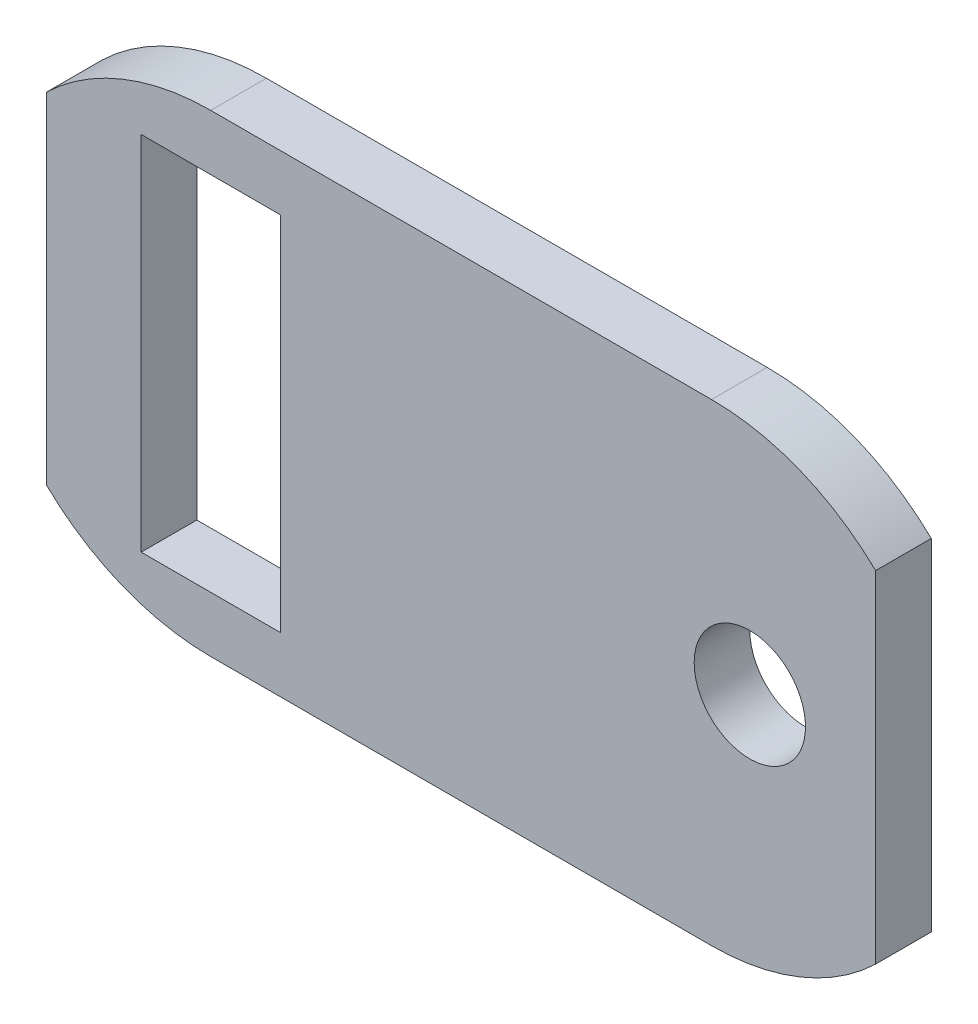
ISO-10303-21;
HEADER;
FILE_DESCRIPTION(('STEP AP214'),'2;1');
FILE_NAME('part.step','',(''),(''),'','','');
FILE_SCHEMA(('AUTOMOTIVE_DESIGN { 1 0 10303 214 1 1 1 1 }'));
ENDSEC;
DATA;
#1=APPLICATION_CONTEXT('core data for automotive mechanical design processes');
#2=APPLICATION_PROTOCOL_DEFINITION('international standard','automotive_design',2000,#1);
#3=PRODUCT_CONTEXT('',#1,'mechanical');
#4=PRODUCT('Part','Part','',(#3));
#5=PRODUCT_RELATED_PRODUCT_CATEGORY('part','',(#4));
#6=PRODUCT_DEFINITION_FORMATION('','',#4);
#7=PRODUCT_DEFINITION_CONTEXT('part definition',#1,'design');
#8=PRODUCT_DEFINITION('design','',#6,#7);
#9=PRODUCT_DEFINITION_SHAPE('','',#8);
#10=(LENGTH_UNIT() NAMED_UNIT(*) SI_UNIT(.MILLI.,.METRE.));
#11=(NAMED_UNIT(*) PLANE_ANGLE_UNIT() SI_UNIT($,.RADIAN.));
#12=(NAMED_UNIT(*) SI_UNIT($,.STERADIAN.) SOLID_ANGLE_UNIT());
#13=UNCERTAINTY_MEASURE_WITH_UNIT(LENGTH_MEASURE(1.E-05),#10,'distance_accuracy_value','');
#14=(GEOMETRIC_REPRESENTATION_CONTEXT(3) GLOBAL_UNCERTAINTY_ASSIGNED_CONTEXT((#13)) GLOBAL_UNIT_ASSIGNED_CONTEXT((#10,
#11,#12)) REPRESENTATION_CONTEXT('',''));
#15=CARTESIAN_POINT('',(0.,0.,0.));
#16=DIRECTION('',(0.,0.,1.));
#17=DIRECTION('',(1.,0.,0.));
#18=AXIS2_PLACEMENT_3D('',#15,#16,#17);
#19=CARTESIAN_POINT('',(38.6757267871688,-27.4690515955081,10.));
#20=DIRECTION('',(0.,0.,-1.));
#21=DIRECTION('',(-1.,0.,0.));
#22=AXIS2_PLACEMENT_3D('',#19,#20,#21);
#23=CYLINDRICAL_SURFACE('',#22,42.5);
#24=CARTESIAN_POINT('',(38.6757267871688,-27.4690515955081,0.));
#25=DIRECTION('',(0.,0.,1.));
#26=DIRECTION('',(-1.,0.,0.));
#27=AXIS2_PLACEMENT_3D('',#24,#25,#26);
#28=CIRCLE('',#27,42.5);
#29=CARTESIAN_POINT('',(38.6757267871688,-69.9690515955081,0.));
#30=VERTEX_POINT('',#29);
#31=CARTESIAN_POINT('',(68.1495571176142,-58.0883808770603,0.));
#32=VERTEX_POINT('',#31);
#33=EDGE_CURVE('E158',#30,#32,#28,.T.);
#34=ORIENTED_EDGE('',*,*,#33,.T.);
#35=DIRECTION('',(0.,0.,-1.));
#36=VECTOR('',#35,1.);
#37=CARTESIAN_POINT('',(68.1495571176142,-58.0883808770603,10.));
#38=LINE('',#37,#36);
#39=CARTESIAN_POINT('',(68.1495571176142,-58.0883808770603,10.));
#40=VERTEX_POINT('',#39);
#41=EDGE_CURVE('E11',#40,#32,#38,.T.);
#42=ORIENTED_EDGE('',*,*,#41,.F.);
#43=CARTESIAN_POINT('',(38.6757267871688,-27.4690515955081,10.));
#44=DIRECTION('',(0.,0.,1.));
#45=DIRECTION('',(-1.,0.,0.));
#46=AXIS2_PLACEMENT_3D('',#43,#44,#45);
#47=CIRCLE('',#46,42.5);
#48=CARTESIAN_POINT('',(38.6757267871688,-69.9690515955081,10.));
#49=VERTEX_POINT('',#48);
#50=EDGE_CURVE('E159',#49,#40,#47,.T.);
#51=ORIENTED_EDGE('',*,*,#50,.F.);
#52=DIRECTION('',(0.,0.,-1.));
#53=VECTOR('',#52,1.);
#54=CARTESIAN_POINT('',(38.6757267871688,-69.9690515955081,10.));
#55=LINE('',#54,#53);
#56=EDGE_CURVE('E177',#49,#30,#55,.T.);
#57=ORIENTED_EDGE('',*,*,#56,.T.);
#58=EDGE_LOOP('',(#34,#42,#51,#57));
#59=FACE_BOUND('',#58,.T.);
#60=ADVANCED_FACE('F33',(#59),#23,.T.);
#61=CARTESIAN_POINT('',(68.1495571176142,3.15027768604416,10.));
#62=DIRECTION('',(-1.,0.,0.));
#63=DIRECTION('',(0.,0.,1.));
#64=AXIS2_PLACEMENT_3D('',#61,#62,#63);
#65=PLANE('',#64);
#66=DIRECTION('',(0.,1.,0.));
#67=VECTOR('',#66,1.);
#68=CARTESIAN_POINT('',(68.1495571176142,3.15027768604416,0.));
#69=LINE('',#68,#67);
#70=CARTESIAN_POINT('',(68.1495571176142,3.15027768604416,0.));
#71=VERTEX_POINT('',#70);
#72=EDGE_CURVE('E180',#32,#71,#69,.T.);
#73=ORIENTED_EDGE('',*,*,#72,.T.);
#74=DIRECTION('',(0.,0.,-1.));
#75=VECTOR('',#74,1.);
#76=CARTESIAN_POINT('',(68.1495571176142,3.15027768604416,10.));
#77=LINE('',#76,#75);
#78=CARTESIAN_POINT('',(68.1495571176142,3.15027768604416,10.));
#79=VERTEX_POINT('',#78);
#80=EDGE_CURVE('E40',#79,#71,#77,.T.);
#81=ORIENTED_EDGE('',*,*,#80,.F.);
#82=DIRECTION('',(0.,1.,0.));
#83=VECTOR('',#82,1.);
#84=CARTESIAN_POINT('',(68.1495571176142,3.15027768604416,10.));
#85=LINE('',#84,#83);
#86=EDGE_CURVE('E162',#40,#79,#85,.T.);
#87=ORIENTED_EDGE('',*,*,#86,.F.);
#88=ORIENTED_EDGE('',*,*,#41,.T.);
#89=EDGE_LOOP('',(#73,#81,#87,#88));
#90=FACE_BOUND('',#89,.T.);
#91=ADVANCED_FACE('F235',(#90),#65,.F.);
#92=CARTESIAN_POINT('',(38.6757267871688,-27.4690515955081,10.));
#93=DIRECTION('',(0.,0.,-1.));
#94=DIRECTION('',(-1.,0.,0.));
#95=AXIS2_PLACEMENT_3D('',#92,#93,#94);
#96=CYLINDRICAL_SURFACE('',#95,42.5);
#97=CARTESIAN_POINT('',(38.6757267871688,-27.4690515955081,0.));
#98=DIRECTION('',(0.,0.,1.));
#99=DIRECTION('',(-1.,0.,0.));
#100=AXIS2_PLACEMENT_3D('',#97,#98,#99);
#101=CIRCLE('',#100,42.5);
#102=CARTESIAN_POINT('',(38.6757267871688,15.0309484044919,0.));
#103=VERTEX_POINT('',#102);
#104=EDGE_CURVE('E182',#71,#103,#101,.T.);
#105=ORIENTED_EDGE('',*,*,#104,.T.);
#106=DIRECTION('',(0.,0.,-1.));
#107=VECTOR('',#106,1.);
#108=CARTESIAN_POINT('',(38.6757267871688,15.0309484044919,10.));
#109=LINE('',#108,#107);
#110=CARTESIAN_POINT('',(38.6757267871688,15.0309484044919,10.));
#111=VERTEX_POINT('',#110);
#112=EDGE_CURVE('E207',#111,#103,#109,.T.);
#113=ORIENTED_EDGE('',*,*,#112,.F.);
#114=CARTESIAN_POINT('',(38.6757267871688,-27.4690515955081,10.));
#115=DIRECTION('',(0.,0.,1.));
#116=DIRECTION('',(-1.,0.,0.));
#117=AXIS2_PLACEMENT_3D('',#114,#115,#116);
#118=CIRCLE('',#117,42.5);
#119=EDGE_CURVE('E165',#79,#111,#118,.T.);
#120=ORIENTED_EDGE('',*,*,#119,.F.);
#121=ORIENTED_EDGE('',*,*,#80,.T.);
#122=EDGE_LOOP('',(#105,#113,#120,#121));
#123=FACE_BOUND('',#122,.T.);
#124=ADVANCED_FACE('F214',(#123),#96,.T.);
#125=CARTESIAN_POINT('',(-51.3242732128312,15.030948404492,10.));
#126=DIRECTION('',(0.,-1.,0.));
#127=DIRECTION('',(1.,0.,0.));
#128=AXIS2_PLACEMENT_3D('',#125,#126,#127);
#129=PLANE('',#128);
#130=DIRECTION('',(-1.,0.,0.));
#131=VECTOR('',#130,1.);
#132=CARTESIAN_POINT('',(-51.3242732128312,15.030948404492,0.));
#133=LINE('',#132,#131);
#134=CARTESIAN_POINT('',(-51.3242732128312,15.0309484044919,0.));
#135=VERTEX_POINT('',#134);
#136=EDGE_CURVE('E184',#103,#135,#133,.T.);
#137=ORIENTED_EDGE('',*,*,#136,.T.);
#138=DIRECTION('',(0.,0.,-1.));
#139=VECTOR('',#138,1.);
#140=CARTESIAN_POINT('',(-51.3242732128312,15.0309484044919,10.));
#141=LINE('',#140,#139);
#142=CARTESIAN_POINT('',(-51.3242732128312,15.0309484044919,10.));
#143=VERTEX_POINT('',#142);
#144=EDGE_CURVE('E204',#143,#135,#141,.T.);
#145=ORIENTED_EDGE('',*,*,#144,.F.);
#146=DIRECTION('',(-1.,0.,0.));
#147=VECTOR('',#146,1.);
#148=CARTESIAN_POINT('',(-51.3242732128312,15.030948404492,10.));
#149=LINE('',#148,#147);
#150=EDGE_CURVE('E167',#111,#143,#149,.T.);
#151=ORIENTED_EDGE('',*,*,#150,.F.);
#152=ORIENTED_EDGE('',*,*,#112,.T.);
#153=EDGE_LOOP('',(#137,#145,#151,#152));
#154=FACE_BOUND('',#153,.T.);
#155=ADVANCED_FACE('F223',(#154),#129,.F.);
#156=CARTESIAN_POINT('',(-51.3242732128312,-27.4690515955081,10.));
#157=DIRECTION('',(0.,0.,-1.));
#158=DIRECTION('',(-1.,0.,0.));
#159=AXIS2_PLACEMENT_3D('',#156,#157,#158);
#160=CYLINDRICAL_SURFACE('',#159,42.5);
#161=CARTESIAN_POINT('',(-51.3242732128312,-27.4690515955081,0.));
#162=DIRECTION('',(0.,0.,1.));
#163=DIRECTION('',(1.,0.,0.));
#164=AXIS2_PLACEMENT_3D('',#161,#162,#163);
#165=CIRCLE('',#164,42.5);
#166=CARTESIAN_POINT('',(-80.7981035432765,3.15027768604416,0.));
#167=VERTEX_POINT('',#166);
#168=EDGE_CURVE('E186',#135,#167,#165,.T.);
#169=ORIENTED_EDGE('',*,*,#168,.T.);
#170=DIRECTION('',(0.,0.,-1.));
#171=VECTOR('',#170,1.);
#172=CARTESIAN_POINT('',(-80.7981035432765,3.15027768604416,10.));
#173=LINE('',#172,#171);
#174=CARTESIAN_POINT('',(-80.7981035432765,3.15027768604416,10.));
#175=VERTEX_POINT('',#174);
#176=EDGE_CURVE('E201',#175,#167,#173,.T.);
#177=ORIENTED_EDGE('',*,*,#176,.F.);
#178=CARTESIAN_POINT('',(-51.3242732128312,-27.4690515955081,10.));
#179=DIRECTION('',(0.,0.,1.));
#180=DIRECTION('',(1.,0.,0.));
#181=AXIS2_PLACEMENT_3D('',#178,#179,#180);
#182=CIRCLE('',#181,42.5);
#183=EDGE_CURVE('E169',#143,#175,#182,.T.);
#184=ORIENTED_EDGE('',*,*,#183,.F.);
#185=ORIENTED_EDGE('',*,*,#144,.T.);
#186=EDGE_LOOP('',(#169,#177,#184,#185));
#187=FACE_BOUND('',#186,.T.);
#188=ADVANCED_FACE('F227',(#187),#160,.T.);
#189=CARTESIAN_POINT('',(-80.7981035432765,3.15027768604416,10.));
#190=DIRECTION('',(1.,0.,0.));
#191=DIRECTION('',(0.,0.,-1.));
#192=AXIS2_PLACEMENT_3D('',#189,#190,#191);
#193=PLANE('',#192);
#194=DIRECTION('',(0.,-1.,0.));
#195=VECTOR('',#194,1.);
#196=CARTESIAN_POINT('',(-80.7981035432765,3.15027768604416,0.));
#197=LINE('',#196,#195);
#198=CARTESIAN_POINT('',(-80.7981035432765,-58.0883808770603,0.));
#199=VERTEX_POINT('',#198);
#200=EDGE_CURVE('E188',#167,#199,#197,.T.);
#201=ORIENTED_EDGE('',*,*,#200,.T.);
#202=DIRECTION('',(0.,0.,-1.));
#203=VECTOR('',#202,1.);
#204=CARTESIAN_POINT('',(-80.7981035432765,-58.0883808770603,10.));
#205=LINE('',#204,#203);
#206=CARTESIAN_POINT('',(-80.7981035432765,-58.0883808770603,10.));
#207=VERTEX_POINT('',#206);
#208=EDGE_CURVE('E198',#207,#199,#205,.T.);
#209=ORIENTED_EDGE('',*,*,#208,.F.);
#210=DIRECTION('',(0.,-1.,0.));
#211=VECTOR('',#210,1.);
#212=CARTESIAN_POINT('',(-80.7981035432765,3.15027768604416,10.));
#213=LINE('',#212,#211);
#214=EDGE_CURVE('E171',#175,#207,#213,.T.);
#215=ORIENTED_EDGE('',*,*,#214,.F.);
#216=ORIENTED_EDGE('',*,*,#176,.T.);
#217=EDGE_LOOP('',(#201,#209,#215,#216));
#218=FACE_BOUND('',#217,.T.);
#219=ADVANCED_FACE('F248',(#218),#193,.F.);
#220=CARTESIAN_POINT('',(-51.3242732128312,-27.4690515955081,10.));
#221=DIRECTION('',(0.,0.,-1.));
#222=DIRECTION('',(-1.,0.,0.));
#223=AXIS2_PLACEMENT_3D('',#220,#221,#222);
#224=CYLINDRICAL_SURFACE('',#223,42.5);
#225=CARTESIAN_POINT('',(-51.3242732128312,-27.4690515955081,0.));
#226=DIRECTION('',(0.,0.,1.));
#227=DIRECTION('',(1.,0.,0.));
#228=AXIS2_PLACEMENT_3D('',#225,#226,#227);
#229=CIRCLE('',#228,42.5);
#230=CARTESIAN_POINT('',(-51.3242732128312,-69.9690515955081,0.));
#231=VERTEX_POINT('',#230);
#232=EDGE_CURVE('E190',#199,#231,#229,.T.);
#233=ORIENTED_EDGE('',*,*,#232,.T.);
#234=DIRECTION('',(0.,0.,-1.));
#235=VECTOR('',#234,1.);
#236=CARTESIAN_POINT('',(-51.3242732128312,-69.9690515955081,10.));
#237=LINE('',#236,#235);
#238=CARTESIAN_POINT('',(-51.3242732128312,-69.9690515955081,10.));
#239=VERTEX_POINT('',#238);
#240=EDGE_CURVE('E195',#239,#231,#237,.T.);
#241=ORIENTED_EDGE('',*,*,#240,.F.);
#242=CARTESIAN_POINT('',(-51.3242732128312,-27.4690515955081,10.));
#243=DIRECTION('',(0.,0.,1.));
#244=DIRECTION('',(1.,0.,0.));
#245=AXIS2_PLACEMENT_3D('',#242,#243,#244);
#246=CIRCLE('',#245,42.5);
#247=EDGE_CURVE('E173',#207,#239,#246,.T.);
#248=ORIENTED_EDGE('',*,*,#247,.F.);
#249=ORIENTED_EDGE('',*,*,#208,.T.);
#250=EDGE_LOOP('',(#233,#241,#248,#249));
#251=FACE_BOUND('',#250,.T.);
#252=ADVANCED_FACE('F246',(#251),#224,.T.);
#253=CARTESIAN_POINT('',(38.6757267871688,-69.9690515955081,10.));
#254=DIRECTION('',(0.,1.,0.));
#255=DIRECTION('',(0.,0.,1.));
#256=AXIS2_PLACEMENT_3D('',#253,#254,#255);
#257=PLANE('',#256);
#258=DIRECTION('',(1.,0.,0.));
#259=VECTOR('',#258,1.);
#260=CARTESIAN_POINT('',(38.6757267871688,-69.9690515955081,0.));
#261=LINE('',#260,#259);
#262=EDGE_CURVE('E163',#231,#30,#261,.T.);
#263=ORIENTED_EDGE('',*,*,#262,.T.);
#264=ORIENTED_EDGE('',*,*,#56,.F.);
#265=DIRECTION('',(1.,0.,0.));
#266=VECTOR('',#265,1.);
#267=CARTESIAN_POINT('',(38.6757267871688,-69.9690515955081,10.));
#268=LINE('',#267,#266);
#269=EDGE_CURVE('E175',#239,#49,#268,.T.);
#270=ORIENTED_EDGE('',*,*,#269,.F.);
#271=ORIENTED_EDGE('',*,*,#240,.T.);
#272=EDGE_LOOP('',(#263,#264,#270,#271));
#273=FACE_BOUND('',#272,.T.);
#274=ADVANCED_FACE('F241',(#273),#257,.F.);
#275=CARTESIAN_POINT('',(38.6757267871688,-27.4690515955081,10.));
#276=DIRECTION('',(0.,0.,-1.));
#277=DIRECTION('',(-1.,0.,0.));
#278=AXIS2_PLACEMENT_3D('',#275,#276,#277);
#279=PLANE('',#278);
#280=CARTESIAN_POINT('',(45.5439814509653,-27.469051595508,10.));
#281=DIRECTION('',(0.,0.,-1.));
#282=DIRECTION('',(-1.,0.,0.));
#283=AXIS2_PLACEMENT_3D('',#280,#281,#282);
#284=CIRCLE('',#283,9.99999999999999);
#285=CARTESIAN_POINT('',(35.5439814509653,-27.469051595508,10.));
#286=VERTEX_POINT('',#285);
#287=EDGE_CURVE('E366',#286,#286,#284,.T.);
#288=ORIENTED_EDGE('',*,*,#287,.T.);
#289=EDGE_LOOP('',(#288));
#290=FACE_BOUND('',#289,.T.);
#291=DIRECTION('',(-1.,0.,0.));
#292=VECTOR('',#291,1.);
#293=CARTESIAN_POINT('',(38.6757267871688,-59.9690515955081,10.));
#294=LINE('',#293,#292);
#295=CARTESIAN_POINT('',(-38.8242732128312,-59.9690515955081,10.));
#296=VERTEX_POINT('',#295);
#297=CARTESIAN_POINT('',(-63.8242732128312,-59.9690515955081,10.));
#298=VERTEX_POINT('',#297);
#299=EDGE_CURVE('E152',#296,#298,#294,.T.);
#300=ORIENTED_EDGE('',*,*,#299,.T.);
#301=DIRECTION('',(0.,1.,0.));
#302=VECTOR('',#301,1.);
#303=CARTESIAN_POINT('',(-63.8242732128312,-27.4690515955081,10.));
#304=LINE('',#303,#302);
#305=CARTESIAN_POINT('',(-63.8242732128312,5.03094840449193,10.));
#306=VERTEX_POINT('',#305);
#307=EDGE_CURVE('E155',#298,#306,#304,.T.);
#308=ORIENTED_EDGE('',*,*,#307,.T.);
#309=DIRECTION('',(1.,0.,0.));
#310=VECTOR('',#309,1.);
#311=CARTESIAN_POINT('',(38.6757267871688,5.03094840449193,10.));
#312=LINE('',#311,#310);
#313=CARTESIAN_POINT('',(-38.8242732128312,5.03094840449193,10.));
#314=VERTEX_POINT('',#313);
#315=EDGE_CURVE('E147',#306,#314,#312,.T.);
#316=ORIENTED_EDGE('',*,*,#315,.T.);
#317=DIRECTION('',(0.,-1.,0.));
#318=VECTOR('',#317,1.);
#319=CARTESIAN_POINT('',(-38.8242732128312,-27.4690515955081,10.));
#320=LINE('',#319,#318);
#321=EDGE_CURVE('E127',#314,#296,#320,.T.);
#322=ORIENTED_EDGE('',*,*,#321,.T.);
#323=EDGE_LOOP('',(#300,#308,#316,#322));
#324=FACE_BOUND('',#323,.T.);
#325=ORIENTED_EDGE('',*,*,#50,.T.);
#326=ORIENTED_EDGE('',*,*,#86,.T.);
#327=ORIENTED_EDGE('',*,*,#119,.T.);
#328=ORIENTED_EDGE('',*,*,#150,.T.);
#329=ORIENTED_EDGE('',*,*,#183,.T.);
#330=ORIENTED_EDGE('',*,*,#214,.T.);
#331=ORIENTED_EDGE('',*,*,#247,.T.);
#332=ORIENTED_EDGE('',*,*,#269,.T.);
#333=EDGE_LOOP('',(#325,#326,#327,#328,#329,#330,#331,#332));
#334=FACE_BOUND('',#333,.T.);
#335=ADVANCED_FACE('F231',(#290,#324,#334),#279,.F.);
#336=CARTESIAN_POINT('',(38.6757267871688,-27.4690515955081,0.));
#337=DIRECTION('',(0.,0.,-1.));
#338=DIRECTION('',(-1.,0.,0.));
#339=AXIS2_PLACEMENT_3D('',#336,#337,#338);
#340=PLANE('',#339);
#341=CARTESIAN_POINT('',(45.5439814509653,-27.469051595508,0.));
#342=DIRECTION('',(0.,0.,-1.));
#343=DIRECTION('',(-1.,0.,0.));
#344=AXIS2_PLACEMENT_3D('',#341,#342,#343);
#345=CIRCLE('',#344,9.99999999999999);
#346=CARTESIAN_POINT('',(35.5439814509653,-27.469051595508,0.));
#347=VERTEX_POINT('',#346);
#348=EDGE_CURVE('E363',#347,#347,#345,.T.);
#349=ORIENTED_EDGE('',*,*,#348,.F.);
#350=EDGE_LOOP('',(#349));
#351=FACE_BOUND('',#350,.T.);
#352=DIRECTION('',(0.,1.,0.));
#353=VECTOR('',#352,1.);
#354=CARTESIAN_POINT('',(-63.8242732128312,-59.9690515955081,0.));
#355=LINE('',#354,#353);
#356=CARTESIAN_POINT('',(-63.8242732128312,-59.9690515955081,0.));
#357=VERTEX_POINT('',#356);
#358=CARTESIAN_POINT('',(-63.8242732128312,5.03094840449193,0.));
#359=VERTEX_POINT('',#358);
#360=EDGE_CURVE('E55',#357,#359,#355,.T.);
#361=ORIENTED_EDGE('',*,*,#360,.F.);
#362=DIRECTION('',(-1.,0.,0.));
#363=VECTOR('',#362,1.);
#364=CARTESIAN_POINT('',(-38.8242732128312,-59.9690515955081,0.));
#365=LINE('',#364,#363);
#366=CARTESIAN_POINT('',(-38.8242732128312,-59.9690515955081,0.));
#367=VERTEX_POINT('',#366);
#368=EDGE_CURVE('E140',#367,#357,#365,.T.);
#369=ORIENTED_EDGE('',*,*,#368,.F.);
#370=DIRECTION('',(0.,-1.,0.));
#371=VECTOR('',#370,1.);
#372=CARTESIAN_POINT('',(-38.8242732128312,-59.9690515955081,0.));
#373=LINE('',#372,#371);
#374=CARTESIAN_POINT('',(-38.8242732128312,5.03094840449193,0.));
#375=VERTEX_POINT('',#374);
#376=EDGE_CURVE('E124',#375,#367,#373,.T.);
#377=ORIENTED_EDGE('',*,*,#376,.F.);
#378=DIRECTION('',(1.,0.,0.));
#379=VECTOR('',#378,1.);
#380=CARTESIAN_POINT('',(-38.8242732128312,5.03094840449193,0.));
#381=LINE('',#380,#379);
#382=EDGE_CURVE('E133',#359,#375,#381,.T.);
#383=ORIENTED_EDGE('',*,*,#382,.F.);
#384=EDGE_LOOP('',(#361,#369,#377,#383));
#385=FACE_BOUND('',#384,.T.);
#386=ORIENTED_EDGE('',*,*,#33,.F.);
#387=ORIENTED_EDGE('',*,*,#262,.F.);
#388=ORIENTED_EDGE('',*,*,#232,.F.);
#389=ORIENTED_EDGE('',*,*,#200,.F.);
#390=ORIENTED_EDGE('',*,*,#168,.F.);
#391=ORIENTED_EDGE('',*,*,#136,.F.);
#392=ORIENTED_EDGE('',*,*,#104,.F.);
#393=ORIENTED_EDGE('',*,*,#72,.F.);
#394=EDGE_LOOP('',(#386,#387,#388,#389,#390,#391,#392,#393));
#395=FACE_BOUND('',#394,.T.);
#396=ADVANCED_FACE('F137',(#351,#385,#395),#340,.T.);
#397=CARTESIAN_POINT('',(-63.8242732128312,-59.9690515955081,20.));
#398=DIRECTION('',(-1.,0.,0.));
#399=DIRECTION('',(0.,0.,1.));
#400=AXIS2_PLACEMENT_3D('',#397,#398,#399);
#401=PLANE('',#400);
#402=DIRECTION('',(0.,0.,-1.));
#403=VECTOR('',#402,1.);
#404=CARTESIAN_POINT('',(-63.8242732128312,-59.9690515955081,20.));
#405=LINE('',#404,#403);
#406=EDGE_CURVE('E145',#298,#357,#405,.T.);
#407=ORIENTED_EDGE('',*,*,#406,.T.);
#408=ORIENTED_EDGE('',*,*,#360,.T.);
#409=DIRECTION('',(0.,0.,-1.));
#410=VECTOR('',#409,1.);
#411=CARTESIAN_POINT('',(-63.8242732128312,5.03094840449193,20.));
#412=LINE('',#411,#410);
#413=EDGE_CURVE('E130',#306,#359,#412,.T.);
#414=ORIENTED_EDGE('',*,*,#413,.F.);
#415=ORIENTED_EDGE('',*,*,#307,.F.);
#416=EDGE_LOOP('',(#407,#408,#414,#415));
#417=FACE_BOUND('',#416,.T.);
#418=ADVANCED_FACE('F300',(#417),#401,.F.);
#419=CARTESIAN_POINT('',(-38.8242732128312,-59.9690515955081,20.));
#420=DIRECTION('',(0.,-1.,0.));
#421=DIRECTION('',(0.,0.,-1.));
#422=AXIS2_PLACEMENT_3D('',#419,#420,#421);
#423=PLANE('',#422);
#424=DIRECTION('',(0.,0.,-1.));
#425=VECTOR('',#424,1.);
#426=CARTESIAN_POINT('',(-38.8242732128312,-59.9690515955081,20.));
#427=LINE('',#426,#425);
#428=EDGE_CURVE('E129',#296,#367,#427,.T.);
#429=ORIENTED_EDGE('',*,*,#428,.T.);
#430=ORIENTED_EDGE('',*,*,#368,.T.);
#431=ORIENTED_EDGE('',*,*,#406,.F.);
#432=ORIENTED_EDGE('',*,*,#299,.F.);
#433=EDGE_LOOP('',(#429,#430,#431,#432));
#434=FACE_BOUND('',#433,.T.);
#435=ADVANCED_FACE('F305',(#434),#423,.F.);
#436=CARTESIAN_POINT('',(-38.8242732128312,-59.9690515955081,20.));
#437=DIRECTION('',(1.,0.,0.));
#438=DIRECTION('',(0.,0.,-1.));
#439=AXIS2_PLACEMENT_3D('',#436,#437,#438);
#440=PLANE('',#439);
#441=DIRECTION('',(0.,0.,-1.));
#442=VECTOR('',#441,1.);
#443=CARTESIAN_POINT('',(-38.8242732128312,5.03094840449193,20.));
#444=LINE('',#443,#442);
#445=EDGE_CURVE('E47',#314,#375,#444,.T.);
#446=ORIENTED_EDGE('',*,*,#445,.T.);
#447=ORIENTED_EDGE('',*,*,#376,.T.);
#448=ORIENTED_EDGE('',*,*,#428,.F.);
#449=ORIENTED_EDGE('',*,*,#321,.F.);
#450=EDGE_LOOP('',(#446,#447,#448,#449));
#451=FACE_BOUND('',#450,.T.);
#452=ADVANCED_FACE('F121',(#451),#440,.F.);
#453=CARTESIAN_POINT('',(-38.8242732128312,5.03094840449193,20.));
#454=DIRECTION('',(0.,1.,0.));
#455=DIRECTION('',(0.,0.,1.));
#456=AXIS2_PLACEMENT_3D('',#453,#454,#455);
#457=PLANE('',#456);
#458=ORIENTED_EDGE('',*,*,#413,.T.);
#459=ORIENTED_EDGE('',*,*,#382,.T.);
#460=ORIENTED_EDGE('',*,*,#445,.F.);
#461=ORIENTED_EDGE('',*,*,#315,.F.);
#462=EDGE_LOOP('',(#458,#459,#460,#461));
#463=FACE_BOUND('',#462,.T.);
#464=ADVANCED_FACE('F134',(#463),#457,.F.);
#465=CARTESIAN_POINT('',(45.5439814509653,-27.469051595508,20.));
#466=DIRECTION('',(0.,0.,-1.));
#467=DIRECTION('',(-1.,0.,0.));
#468=AXIS2_PLACEMENT_3D('',#465,#466,#467);
#469=CYLINDRICAL_SURFACE('',#468,9.99999999999999);
#470=ORIENTED_EDGE('',*,*,#348,.T.);
#471=EDGE_LOOP('',(#470));
#472=FACE_BOUND('',#471,.T.);
#473=ORIENTED_EDGE('',*,*,#287,.F.);
#474=EDGE_LOOP('',(#473));
#475=FACE_BOUND('',#474,.T.);
#476=ADVANCED_FACE('F333',(#472,#475),#469,.F.);
#477=CLOSED_SHELL('',(#60,#91,#124,#155,#188,#219,#252,#274,#335,#396,#418,#435,#452,#464,#476));
#478=MANIFOLD_SOLID_BREP('B2',#477);
#479=ADVANCED_BREP_SHAPE_REPRESENTATION('',(#18,#478),#14);
#480=SHAPE_DEFINITION_REPRESENTATION(#9,#479);
ENDSEC;
END-ISO-10303-21;
